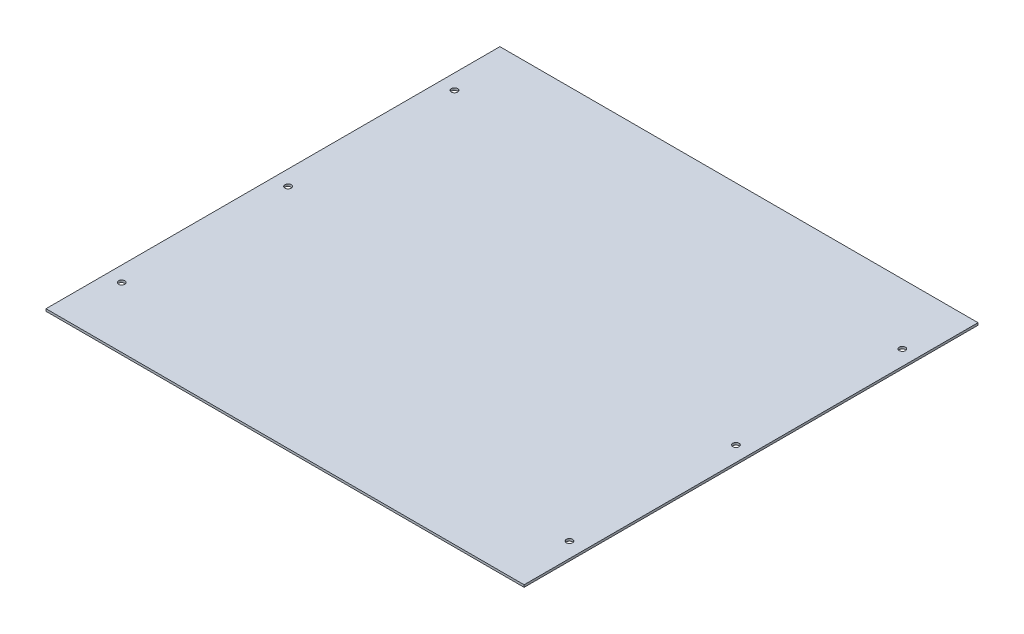
ISO-10303-21;
HEADER;
FILE_DESCRIPTION(('STEP AP214'),'2;1');
FILE_NAME('part.step','',(''),(''),'','','');
FILE_SCHEMA(('AUTOMOTIVE_DESIGN { 1 0 10303 214 1 1 1 1 }'));
ENDSEC;
DATA;
#1=APPLICATION_CONTEXT('core data for automotive mechanical design processes');
#2=APPLICATION_PROTOCOL_DEFINITION('international standard','automotive_design',2000,#1);
#3=PRODUCT_CONTEXT('',#1,'mechanical');
#4=PRODUCT('Part','Part','',(#3));
#5=PRODUCT_RELATED_PRODUCT_CATEGORY('part','',(#4));
#6=PRODUCT_DEFINITION_FORMATION('','',#4);
#7=PRODUCT_DEFINITION_CONTEXT('part definition',#1,'design');
#8=PRODUCT_DEFINITION('design','',#6,#7);
#9=PRODUCT_DEFINITION_SHAPE('','',#8);
#10=(LENGTH_UNIT() NAMED_UNIT(*) SI_UNIT(.MILLI.,.METRE.));
#11=(NAMED_UNIT(*) PLANE_ANGLE_UNIT() SI_UNIT($,.RADIAN.));
#12=(NAMED_UNIT(*) SI_UNIT($,.STERADIAN.) SOLID_ANGLE_UNIT());
#13=UNCERTAINTY_MEASURE_WITH_UNIT(LENGTH_MEASURE(1.E-05),#10,'distance_accuracy_value','');
#14=(GEOMETRIC_REPRESENTATION_CONTEXT(3) GLOBAL_UNCERTAINTY_ASSIGNED_CONTEXT((#13)) GLOBAL_UNIT_ASSIGNED_CONTEXT((#10,
#11,#12)) REPRESENTATION_CONTEXT('',''));
#15=CARTESIAN_POINT('',(0.,0.,0.));
#16=DIRECTION('',(0.,0.,1.));
#17=DIRECTION('',(1.,0.,0.));
#18=AXIS2_PLACEMENT_3D('',#15,#16,#17);
#19=CARTESIAN_POINT('',(0.,0.,0.));
#20=DIRECTION('',(0.,1.,0.));
#21=DIRECTION('',(0.,0.,1.));
#22=AXIS2_PLACEMENT_3D('',#19,#20,#21);
#23=PLANE('',#22);
#24=CARTESIAN_POINT('',(148.,0.,0.));
#25=DIRECTION('',(0.,-1.,0.));
#26=DIRECTION('',(0.,0.,-1.));
#27=AXIS2_PLACEMENT_3D('',#24,#25,#26);
#28=CIRCLE('',#27,2.05);
#29=CARTESIAN_POINT('',(148.,0.,-2.05));
#30=VERTEX_POINT('',#29);
#31=EDGE_CURVE('E185',#30,#30,#28,.T.);
#32=ORIENTED_EDGE('',*,*,#31,.F.);
#33=EDGE_LOOP('',(#32));
#34=FACE_BOUND('',#33,.T.);
#35=CARTESIAN_POINT('',(-148.,0.,110.));
#36=DIRECTION('',(0.,-1.,0.));
#37=DIRECTION('',(0.,0.,-1.));
#38=AXIS2_PLACEMENT_3D('',#35,#36,#37);
#39=CIRCLE('',#38,2.05);
#40=CARTESIAN_POINT('',(-148.,0.,107.95));
#41=VERTEX_POINT('',#40);
#42=EDGE_CURVE('E213',#41,#41,#39,.T.);
#43=ORIENTED_EDGE('',*,*,#42,.F.);
#44=EDGE_LOOP('',(#43));
#45=FACE_BOUND('',#44,.T.);
#46=CARTESIAN_POINT('',(-148.,0.,-110.));
#47=DIRECTION('',(0.,-1.,0.));
#48=DIRECTION('',(0.,0.,-1.));
#49=AXIS2_PLACEMENT_3D('',#46,#47,#48);
#50=CIRCLE('',#49,2.05);
#51=CARTESIAN_POINT('',(-148.,0.,-112.05));
#52=VERTEX_POINT('',#51);
#53=EDGE_CURVE('E104',#52,#52,#50,.T.);
#54=ORIENTED_EDGE('',*,*,#53,.F.);
#55=EDGE_LOOP('',(#54));
#56=FACE_BOUND('',#55,.T.);
#57=DIRECTION('',(1.,0.,0.));
#58=VECTOR('',#57,1.);
#59=CARTESIAN_POINT('',(-138.,0.,150.));
#60=LINE('',#59,#58);
#61=CARTESIAN_POINT('',(-158.,0.,150.));
#62=VERTEX_POINT('',#61);
#63=CARTESIAN_POINT('',(158.,0.,150.));
#64=VERTEX_POINT('',#63);
#65=EDGE_CURVE('E56',#62,#64,#60,.T.);
#66=ORIENTED_EDGE('',*,*,#65,.F.);
#67=DIRECTION('',(0.,0.,1.));
#68=VECTOR('',#67,1.);
#69=CARTESIAN_POINT('',(-158.,0.,150.));
#70=LINE('',#69,#68);
#71=CARTESIAN_POINT('',(-158.,0.,-150.));
#72=VERTEX_POINT('',#71);
#73=EDGE_CURVE('E121',#72,#62,#70,.T.);
#74=ORIENTED_EDGE('',*,*,#73,.F.);
#75=DIRECTION('',(1.,0.,0.));
#76=VECTOR('',#75,1.);
#77=CARTESIAN_POINT('',(-138.,0.,-150.));
#78=LINE('',#77,#76);
#79=CARTESIAN_POINT('',(158.,0.,-150.));
#80=VERTEX_POINT('',#79);
#81=EDGE_CURVE('E42',#72,#80,#78,.T.);
#82=ORIENTED_EDGE('',*,*,#81,.T.);
#83=DIRECTION('',(0.,0.,-1.));
#84=VECTOR('',#83,1.);
#85=CARTESIAN_POINT('',(158.,0.,-150.));
#86=LINE('',#85,#84);
#87=EDGE_CURVE('E98',#64,#80,#86,.T.);
#88=ORIENTED_EDGE('',*,*,#87,.F.);
#89=EDGE_LOOP('',(#66,#74,#82,#88));
#90=FACE_BOUND('',#89,.T.);
#91=CARTESIAN_POINT('',(-148.,0.,0.));
#92=DIRECTION('',(0.,-1.,0.));
#93=DIRECTION('',(0.,0.,-1.));
#94=AXIS2_PLACEMENT_3D('',#91,#92,#93);
#95=CIRCLE('',#94,2.05);
#96=CARTESIAN_POINT('',(-148.,0.,-2.05000000000002));
#97=VERTEX_POINT('',#96);
#98=EDGE_CURVE('E205',#97,#97,#95,.T.);
#99=ORIENTED_EDGE('',*,*,#98,.F.);
#100=EDGE_LOOP('',(#99));
#101=FACE_BOUND('',#100,.T.);
#102=CARTESIAN_POINT('',(148.,0.,110.));
#103=DIRECTION('',(0.,-1.,0.));
#104=DIRECTION('',(0.,0.,-1.));
#105=AXIS2_PLACEMENT_3D('',#102,#103,#104);
#106=CIRCLE('',#105,2.05);
#107=CARTESIAN_POINT('',(148.,0.,107.95));
#108=VERTEX_POINT('',#107);
#109=EDGE_CURVE('E197',#108,#108,#106,.T.);
#110=ORIENTED_EDGE('',*,*,#109,.F.);
#111=EDGE_LOOP('',(#110));
#112=FACE_BOUND('',#111,.T.);
#113=CARTESIAN_POINT('',(148.,0.,-110.));
#114=DIRECTION('',(0.,-1.,0.));
#115=DIRECTION('',(0.,0.,-1.));
#116=AXIS2_PLACEMENT_3D('',#113,#114,#115);
#117=CIRCLE('',#116,2.05);
#118=CARTESIAN_POINT('',(148.,0.,-112.05));
#119=VERTEX_POINT('',#118);
#120=EDGE_CURVE('E180',#119,#119,#117,.T.);
#121=ORIENTED_EDGE('',*,*,#120,.F.);
#122=EDGE_LOOP('',(#121));
#123=FACE_BOUND('',#122,.T.);
#124=ADVANCED_FACE('F38',(#34,#45,#56,#90,#101,#112,#123),#23,.F.);
#125=CARTESIAN_POINT('',(-138.,1.5,150.));
#126=DIRECTION('',(0.,0.,-1.));
#127=DIRECTION('',(-1.,0.,0.));
#128=AXIS2_PLACEMENT_3D('',#125,#126,#127);
#129=PLANE('',#128);
#130=ORIENTED_EDGE('',*,*,#65,.T.);
#131=DIRECTION('',(0.,-1.,0.));
#132=VECTOR('',#131,1.);
#133=CARTESIAN_POINT('',(158.,0.,150.));
#134=LINE('',#133,#132);
#135=CARTESIAN_POINT('',(158.,1.49999999999996,150.));
#136=VERTEX_POINT('',#135);
#137=EDGE_CURVE('E94',#136,#64,#134,.T.);
#138=ORIENTED_EDGE('',*,*,#137,.F.);
#139=DIRECTION('',(1.,0.,0.));
#140=VECTOR('',#139,1.);
#141=CARTESIAN_POINT('',(-138.,1.5,150.));
#142=LINE('',#141,#140);
#143=CARTESIAN_POINT('',(-158.,1.5,150.));
#144=VERTEX_POINT('',#143);
#145=EDGE_CURVE('E48',#144,#136,#142,.T.);
#146=ORIENTED_EDGE('',*,*,#145,.F.);
#147=DIRECTION('',(0.,1.,0.));
#148=VECTOR('',#147,1.);
#149=CARTESIAN_POINT('',(-158.,0.,150.));
#150=LINE('',#149,#148);
#151=EDGE_CURVE('E112',#62,#144,#150,.T.);
#152=ORIENTED_EDGE('',*,*,#151,.F.);
#153=EDGE_LOOP('',(#130,#138,#146,#152));
#154=FACE_BOUND('',#153,.T.);
#155=ADVANCED_FACE('F40',(#154),#129,.F.);
#156=CARTESIAN_POINT('',(-138.,1.5,-150.));
#157=DIRECTION('',(0.,0.,-1.));
#158=DIRECTION('',(-1.,0.,0.));
#159=AXIS2_PLACEMENT_3D('',#156,#157,#158);
#160=PLANE('',#159);
#161=ORIENTED_EDGE('',*,*,#81,.F.);
#162=DIRECTION('',(0.,-1.,0.));
#163=VECTOR('',#162,1.);
#164=CARTESIAN_POINT('',(-158.,0.,-150.));
#165=LINE('',#164,#163);
#166=CARTESIAN_POINT('',(-158.,1.49999999999996,-150.));
#167=VERTEX_POINT('',#166);
#168=EDGE_CURVE('E83',#167,#72,#165,.T.);
#169=ORIENTED_EDGE('',*,*,#168,.F.);
#170=DIRECTION('',(1.,0.,0.));
#171=VECTOR('',#170,1.);
#172=CARTESIAN_POINT('',(-138.,1.5,-150.));
#173=LINE('',#172,#171);
#174=CARTESIAN_POINT('',(158.,1.5,-150.));
#175=VERTEX_POINT('',#174);
#176=EDGE_CURVE('E11',#167,#175,#173,.T.);
#177=ORIENTED_EDGE('',*,*,#176,.T.);
#178=DIRECTION('',(0.,1.,0.));
#179=VECTOR('',#178,1.);
#180=CARTESIAN_POINT('',(158.,0.,-150.));
#181=LINE('',#180,#179);
#182=EDGE_CURVE('E82',#80,#175,#181,.T.);
#183=ORIENTED_EDGE('',*,*,#182,.F.);
#184=EDGE_LOOP('',(#161,#169,#177,#183));
#185=FACE_BOUND('',#184,.T.);
#186=ADVANCED_FACE('F80',(#185),#160,.T.);
#187=CARTESIAN_POINT('',(0.,1.5,0.));
#188=DIRECTION('',(0.,1.,0.));
#189=DIRECTION('',(0.,0.,1.));
#190=AXIS2_PLACEMENT_3D('',#187,#188,#189);
#191=PLANE('',#190);
#192=CARTESIAN_POINT('',(148.,1.5,-110.));
#193=DIRECTION('',(0.,1.,0.));
#194=DIRECTION('',(0.,0.,1.));
#195=AXIS2_PLACEMENT_3D('',#192,#193,#194);
#196=CIRCLE('',#195,2.05);
#197=CARTESIAN_POINT('',(148.,1.5,-107.95));
#198=VERTEX_POINT('',#197);
#199=EDGE_CURVE('E183',#198,#198,#196,.T.);
#200=ORIENTED_EDGE('',*,*,#199,.F.);
#201=EDGE_LOOP('',(#200));
#202=FACE_BOUND('',#201,.T.);
#203=CARTESIAN_POINT('',(148.,1.5,0.));
#204=DIRECTION('',(0.,1.,0.));
#205=DIRECTION('',(0.,0.,1.));
#206=AXIS2_PLACEMENT_3D('',#203,#204,#205);
#207=CIRCLE('',#206,2.05);
#208=CARTESIAN_POINT('',(148.,1.5,2.05));
#209=VERTEX_POINT('',#208);
#210=EDGE_CURVE('E190',#209,#209,#207,.T.);
#211=ORIENTED_EDGE('',*,*,#210,.F.);
#212=EDGE_LOOP('',(#211));
#213=FACE_BOUND('',#212,.T.);
#214=CARTESIAN_POINT('',(148.,1.5,110.));
#215=DIRECTION('',(0.,1.,0.));
#216=DIRECTION('',(0.,0.,1.));
#217=AXIS2_PLACEMENT_3D('',#214,#215,#216);
#218=CIRCLE('',#217,2.05);
#219=CARTESIAN_POINT('',(148.,1.5,112.05));
#220=VERTEX_POINT('',#219);
#221=EDGE_CURVE('E201',#220,#220,#218,.T.);
#222=ORIENTED_EDGE('',*,*,#221,.F.);
#223=EDGE_LOOP('',(#222));
#224=FACE_BOUND('',#223,.T.);
#225=CARTESIAN_POINT('',(-148.,1.5,0.));
#226=DIRECTION('',(0.,1.,0.));
#227=DIRECTION('',(0.,0.,1.));
#228=AXIS2_PLACEMENT_3D('',#225,#226,#227);
#229=CIRCLE('',#228,2.05);
#230=CARTESIAN_POINT('',(-148.,1.5,2.04999999999997));
#231=VERTEX_POINT('',#230);
#232=EDGE_CURVE('E209',#231,#231,#229,.T.);
#233=ORIENTED_EDGE('',*,*,#232,.F.);
#234=EDGE_LOOP('',(#233));
#235=FACE_BOUND('',#234,.T.);
#236=CARTESIAN_POINT('',(-148.,1.5,110.));
#237=DIRECTION('',(0.,1.,0.));
#238=DIRECTION('',(0.,0.,1.));
#239=AXIS2_PLACEMENT_3D('',#236,#237,#238);
#240=CIRCLE('',#239,2.05);
#241=CARTESIAN_POINT('',(-148.,1.5,112.05));
#242=VERTEX_POINT('',#241);
#243=EDGE_CURVE('E217',#242,#242,#240,.T.);
#244=ORIENTED_EDGE('',*,*,#243,.F.);
#245=EDGE_LOOP('',(#244));
#246=FACE_BOUND('',#245,.T.);
#247=CARTESIAN_POINT('',(-148.,1.5,-110.));
#248=DIRECTION('',(0.,1.,0.));
#249=DIRECTION('',(0.,0.,1.));
#250=AXIS2_PLACEMENT_3D('',#247,#248,#249);
#251=CIRCLE('',#250,2.05);
#252=CARTESIAN_POINT('',(-148.,1.5,-107.95));
#253=VERTEX_POINT('',#252);
#254=EDGE_CURVE('E100',#253,#253,#251,.T.);
#255=ORIENTED_EDGE('',*,*,#254,.F.);
#256=EDGE_LOOP('',(#255));
#257=FACE_BOUND('',#256,.T.);
#258=ORIENTED_EDGE('',*,*,#145,.T.);
#259=DIRECTION('',(0.,0.,1.));
#260=VECTOR('',#259,1.);
#261=CARTESIAN_POINT('',(158.,1.5,-150.));
#262=LINE('',#261,#260);
#263=EDGE_CURVE('E88',#175,#136,#262,.T.);
#264=ORIENTED_EDGE('',*,*,#263,.F.);
#265=ORIENTED_EDGE('',*,*,#176,.F.);
#266=DIRECTION('',(0.,0.,-1.));
#267=VECTOR('',#266,1.);
#268=CARTESIAN_POINT('',(-158.,1.5,150.));
#269=LINE('',#268,#267);
#270=EDGE_CURVE('E116',#144,#167,#269,.T.);
#271=ORIENTED_EDGE('',*,*,#270,.F.);
#272=EDGE_LOOP('',(#258,#264,#265,#271));
#273=FACE_BOUND('',#272,.T.);
#274=ADVANCED_FACE('F89',(#202,#213,#224,#235,#246,#257,#273),#191,.T.);
#275=CARTESIAN_POINT('',(-158.,0.,0.));
#276=DIRECTION('',(-1.,0.,0.));
#277=DIRECTION('',(0.,0.,1.));
#278=AXIS2_PLACEMENT_3D('',#275,#276,#277);
#279=PLANE('',#278);
#280=ORIENTED_EDGE('',*,*,#151,.T.);
#281=ORIENTED_EDGE('',*,*,#270,.T.);
#282=ORIENTED_EDGE('',*,*,#168,.T.);
#283=ORIENTED_EDGE('',*,*,#73,.T.);
#284=EDGE_LOOP('',(#280,#281,#282,#283));
#285=FACE_BOUND('',#284,.T.);
#286=ADVANCED_FACE('F131',(#285),#279,.T.);
#287=CARTESIAN_POINT('',(158.,0.,0.));
#288=DIRECTION('',(1.,0.,0.));
#289=DIRECTION('',(0.,0.,-1.));
#290=AXIS2_PLACEMENT_3D('',#287,#288,#289);
#291=PLANE('',#290);
#292=ORIENTED_EDGE('',*,*,#182,.T.);
#293=ORIENTED_EDGE('',*,*,#263,.T.);
#294=ORIENTED_EDGE('',*,*,#137,.T.);
#295=ORIENTED_EDGE('',*,*,#87,.T.);
#296=EDGE_LOOP('',(#292,#293,#294,#295));
#297=FACE_BOUND('',#296,.T.);
#298=ADVANCED_FACE('F97',(#297),#291,.T.);
#299=CARTESIAN_POINT('',(-148.,0.,-110.));
#300=DIRECTION('',(0.,-1.,0.));
#301=DIRECTION('',(0.,0.,-1.));
#302=AXIS2_PLACEMENT_3D('',#299,#300,#301);
#303=CYLINDRICAL_SURFACE('',#302,2.05);
#304=ORIENTED_EDGE('',*,*,#53,.T.);
#305=EDGE_LOOP('',(#304));
#306=FACE_BOUND('',#305,.T.);
#307=ORIENTED_EDGE('',*,*,#254,.T.);
#308=EDGE_LOOP('',(#307));
#309=FACE_BOUND('',#308,.T.);
#310=ADVANCED_FACE('F152',(#306,#309),#303,.F.);
#311=CARTESIAN_POINT('',(-148.,0.,110.));
#312=DIRECTION('',(0.,-1.,0.));
#313=DIRECTION('',(0.,0.,-1.));
#314=AXIS2_PLACEMENT_3D('',#311,#312,#313);
#315=CYLINDRICAL_SURFACE('',#314,2.05);
#316=ORIENTED_EDGE('',*,*,#42,.T.);
#317=EDGE_LOOP('',(#316));
#318=FACE_BOUND('',#317,.T.);
#319=ORIENTED_EDGE('',*,*,#243,.T.);
#320=EDGE_LOOP('',(#319));
#321=FACE_BOUND('',#320,.T.);
#322=ADVANCED_FACE('F155',(#318,#321),#315,.F.);
#323=CARTESIAN_POINT('',(-148.,0.,0.));
#324=DIRECTION('',(0.,-1.,0.));
#325=DIRECTION('',(0.,0.,-1.));
#326=AXIS2_PLACEMENT_3D('',#323,#324,#325);
#327=CYLINDRICAL_SURFACE('',#326,2.05);
#328=ORIENTED_EDGE('',*,*,#98,.T.);
#329=EDGE_LOOP('',(#328));
#330=FACE_BOUND('',#329,.T.);
#331=ORIENTED_EDGE('',*,*,#232,.T.);
#332=EDGE_LOOP('',(#331));
#333=FACE_BOUND('',#332,.T.);
#334=ADVANCED_FACE('F159',(#330,#333),#327,.F.);
#335=CARTESIAN_POINT('',(148.,0.,110.));
#336=DIRECTION('',(0.,-1.,0.));
#337=DIRECTION('',(0.,0.,-1.));
#338=AXIS2_PLACEMENT_3D('',#335,#336,#337);
#339=CYLINDRICAL_SURFACE('',#338,2.05);
#340=ORIENTED_EDGE('',*,*,#109,.T.);
#341=EDGE_LOOP('',(#340));
#342=FACE_BOUND('',#341,.T.);
#343=ORIENTED_EDGE('',*,*,#221,.T.);
#344=EDGE_LOOP('',(#343));
#345=FACE_BOUND('',#344,.T.);
#346=ADVANCED_FACE('F163',(#342,#345),#339,.F.);
#347=CARTESIAN_POINT('',(148.,0.,0.));
#348=DIRECTION('',(0.,-1.,0.));
#349=DIRECTION('',(0.,0.,-1.));
#350=AXIS2_PLACEMENT_3D('',#347,#348,#349);
#351=CYLINDRICAL_SURFACE('',#350,2.05);
#352=ORIENTED_EDGE('',*,*,#31,.T.);
#353=EDGE_LOOP('',(#352));
#354=FACE_BOUND('',#353,.T.);
#355=ORIENTED_EDGE('',*,*,#210,.T.);
#356=EDGE_LOOP('',(#355));
#357=FACE_BOUND('',#356,.T.);
#358=ADVANCED_FACE('F167',(#354,#357),#351,.F.);
#359=CARTESIAN_POINT('',(148.,0.,-110.));
#360=DIRECTION('',(0.,-1.,0.));
#361=DIRECTION('',(0.,0.,-1.));
#362=AXIS2_PLACEMENT_3D('',#359,#360,#361);
#363=CYLINDRICAL_SURFACE('',#362,2.05);
#364=ORIENTED_EDGE('',*,*,#120,.T.);
#365=EDGE_LOOP('',(#364));
#366=FACE_BOUND('',#365,.T.);
#367=ORIENTED_EDGE('',*,*,#199,.T.);
#368=EDGE_LOOP('',(#367));
#369=FACE_BOUND('',#368,.T.);
#370=ADVANCED_FACE('F171',(#366,#369),#363,.F.);
#371=CLOSED_SHELL('',(#124,#155,#186,#274,#286,#298,#310,#322,#334,#346,#358,#370));
#372=MANIFOLD_SOLID_BREP('B2',#371);
#373=ADVANCED_BREP_SHAPE_REPRESENTATION('',(#18,#372),#14);
#374=SHAPE_DEFINITION_REPRESENTATION(#9,#373);
ENDSEC;
END-ISO-10303-21;
